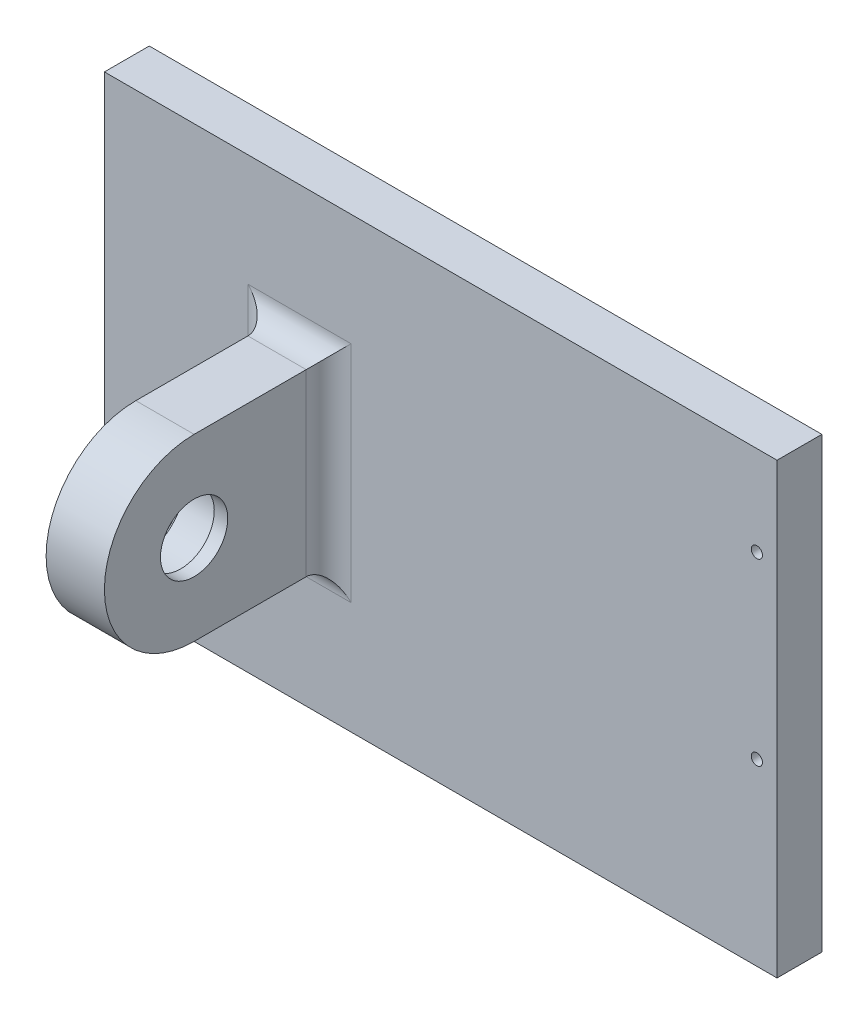
ISO-10303-21;
HEADER;
FILE_DESCRIPTION(('STEP AP214'),'2;1');
FILE_NAME('part.step','',(''),(''),'','','');
FILE_SCHEMA(('AUTOMOTIVE_DESIGN { 1 0 10303 214 1 1 1 1 }'));
ENDSEC;
DATA;
#1=APPLICATION_CONTEXT('core data for automotive mechanical design processes');
#2=APPLICATION_PROTOCOL_DEFINITION('international standard','automotive_design',2000,#1);
#3=PRODUCT_CONTEXT('',#1,'mechanical');
#4=PRODUCT('Part','Part','',(#3));
#5=PRODUCT_RELATED_PRODUCT_CATEGORY('part','',(#4));
#6=PRODUCT_DEFINITION_FORMATION('','',#4);
#7=PRODUCT_DEFINITION_CONTEXT('part definition',#1,'design');
#8=PRODUCT_DEFINITION('design','',#6,#7);
#9=PRODUCT_DEFINITION_SHAPE('','',#8);
#10=(LENGTH_UNIT() NAMED_UNIT(*) SI_UNIT(.MILLI.,.METRE.));
#11=(NAMED_UNIT(*) PLANE_ANGLE_UNIT() SI_UNIT($,.RADIAN.));
#12=(NAMED_UNIT(*) SI_UNIT($,.STERADIAN.) SOLID_ANGLE_UNIT());
#13=UNCERTAINTY_MEASURE_WITH_UNIT(LENGTH_MEASURE(1.E-05),#10,'distance_accuracy_value','');
#14=(GEOMETRIC_REPRESENTATION_CONTEXT(3) GLOBAL_UNCERTAINTY_ASSIGNED_CONTEXT((#13)) GLOBAL_UNIT_ASSIGNED_CONTEXT((#10,
#11,#12)) REPRESENTATION_CONTEXT('',''));
#15=CARTESIAN_POINT('',(0.,0.,0.));
#16=DIRECTION('',(0.,0.,1.));
#17=DIRECTION('',(1.,0.,0.));
#18=AXIS2_PLACEMENT_3D('',#15,#16,#17);
#19=CARTESIAN_POINT('',(0.,0.,10.));
#20=DIRECTION('',(0.,0.,1.));
#21=DIRECTION('',(1.,0.,0.));
#22=AXIS2_PLACEMENT_3D('',#19,#20,#21);
#23=PLANE('',#22);
#24=DIRECTION('',(0.,-1.,0.));
#25=VECTOR('',#24,1.);
#26=CARTESIAN_POINT('',(-20.,0.,10.));
#27=LINE('',#26,#25);
#28=CARTESIAN_POINT('',(-20.,25.,10.));
#29=VERTEX_POINT('',#28);
#30=CARTESIAN_POINT('',(-20.,-25.,10.));
#31=VERTEX_POINT('',#30);
#32=EDGE_CURVE('E189',#29,#31,#27,.T.);
#33=ORIENTED_EDGE('',*,*,#32,.T.);
#34=DIRECTION('',(-1.,0.,0.));
#35=VECTOR('',#34,1.);
#36=CARTESIAN_POINT('',(0.,-25.,10.));
#37=LINE('',#36,#35);
#38=CARTESIAN_POINT('',(-43.,-25.,10.));
#39=VERTEX_POINT('',#38);
#40=EDGE_CURVE('E195',#31,#39,#37,.T.);
#41=ORIENTED_EDGE('',*,*,#40,.T.);
#42=DIRECTION('',(0.,1.,0.));
#43=VECTOR('',#42,1.);
#44=CARTESIAN_POINT('',(-43.,0.,10.));
#45=LINE('',#44,#43);
#46=CARTESIAN_POINT('',(-43.,25.,10.));
#47=VERTEX_POINT('',#46);
#48=EDGE_CURVE('E193',#39,#47,#45,.T.);
#49=ORIENTED_EDGE('',*,*,#48,.T.);
#50=DIRECTION('',(1.,0.,0.));
#51=VECTOR('',#50,1.);
#52=CARTESIAN_POINT('',(0.,25.,10.));
#53=LINE('',#52,#51);
#54=EDGE_CURVE('E191',#47,#29,#53,.T.);
#55=ORIENTED_EDGE('',*,*,#54,.T.);
#56=EDGE_LOOP('',(#33,#41,#49,#55));
#57=FACE_BOUND('',#56,.T.);
#58=CARTESIAN_POINT('',(70.5,-10.00089870144,10.));
#59=DIRECTION('',(0.,0.,1.));
#60=DIRECTION('',(1.,0.,0.));
#61=AXIS2_PLACEMENT_3D('',#58,#59,#60);
#62=CIRCLE('',#61,1.24999999999999);
#63=CARTESIAN_POINT('',(71.75,-10.00089870144,10.));
#64=VERTEX_POINT('',#63);
#65=EDGE_CURVE('E214',#64,#64,#62,.T.);
#66=ORIENTED_EDGE('',*,*,#65,.F.);
#67=EDGE_LOOP('',(#66));
#68=FACE_BOUND('',#67,.T.);
#69=CARTESIAN_POINT('',(70.5,29.99910129856,10.));
#70=DIRECTION('',(0.,0.,1.));
#71=DIRECTION('',(1.,0.,0.));
#72=AXIS2_PLACEMENT_3D('',#69,#70,#71);
#73=CIRCLE('',#72,1.24999999999999);
#74=CARTESIAN_POINT('',(71.75,29.99910129856,10.));
#75=VERTEX_POINT('',#74);
#76=EDGE_CURVE('E321',#75,#75,#73,.T.);
#77=ORIENTED_EDGE('',*,*,#76,.F.);
#78=EDGE_LOOP('',(#77));
#79=FACE_BOUND('',#78,.T.);
#80=DIRECTION('',(0.,1.,0.));
#81=VECTOR('',#80,1.);
#82=CARTESIAN_POINT('',(75.,50.,10.));
#83=LINE('',#82,#81);
#84=CARTESIAN_POINT('',(75.,-50.,10.));
#85=VERTEX_POINT('',#84);
#86=CARTESIAN_POINT('',(75.,50.,10.));
#87=VERTEX_POINT('',#86);
#88=EDGE_CURVE('E160',#85,#87,#83,.T.);
#89=ORIENTED_EDGE('',*,*,#88,.T.);
#90=DIRECTION('',(-1.,0.,0.));
#91=VECTOR('',#90,1.);
#92=CARTESIAN_POINT('',(-75.,50.,10.));
#93=LINE('',#92,#91);
#94=CARTESIAN_POINT('',(-75.,50.,10.));
#95=VERTEX_POINT('',#94);
#96=EDGE_CURVE('E163',#87,#95,#93,.T.);
#97=ORIENTED_EDGE('',*,*,#96,.T.);
#98=DIRECTION('',(0.,-1.,0.));
#99=VECTOR('',#98,1.);
#100=CARTESIAN_POINT('',(-75.,50.,10.));
#101=LINE('',#100,#99);
#102=CARTESIAN_POINT('',(-75.,-50.,10.));
#103=VERTEX_POINT('',#102);
#104=EDGE_CURVE('E166',#95,#103,#101,.T.);
#105=ORIENTED_EDGE('',*,*,#104,.T.);
#106=DIRECTION('',(1.,0.,0.));
#107=VECTOR('',#106,1.);
#108=CARTESIAN_POINT('',(-75.,-50.,10.));
#109=LINE('',#108,#107);
#110=EDGE_CURVE('E168',#103,#85,#109,.T.);
#111=ORIENTED_EDGE('',*,*,#110,.T.);
#112=EDGE_LOOP('',(#89,#97,#105,#111));
#113=FACE_BOUND('',#112,.T.);
#114=ADVANCED_FACE('F43',(#57,#68,#79,#113),#23,.T.);
#115=CARTESIAN_POINT('',(75.,50.,10.));
#116=DIRECTION('',(-1.,0.,0.));
#117=DIRECTION('',(0.,-1.,0.));
#118=AXIS2_PLACEMENT_3D('',#115,#116,#117);
#119=PLANE('',#118);
#120=DIRECTION('',(0.,1.,0.));
#121=VECTOR('',#120,1.);
#122=CARTESIAN_POINT('',(75.,50.,0.));
#123=LINE('',#122,#121);
#124=CARTESIAN_POINT('',(75.,-50.,0.));
#125=VERTEX_POINT('',#124);
#126=CARTESIAN_POINT('',(75.,50.,0.));
#127=VERTEX_POINT('',#126);
#128=EDGE_CURVE('E159',#125,#127,#123,.T.);
#129=ORIENTED_EDGE('',*,*,#128,.T.);
#130=DIRECTION('',(0.,0.,-1.));
#131=VECTOR('',#130,1.);
#132=CARTESIAN_POINT('',(75.,50.,10.));
#133=LINE('',#132,#131);
#134=EDGE_CURVE('E186',#87,#127,#133,.T.);
#135=ORIENTED_EDGE('',*,*,#134,.F.);
#136=ORIENTED_EDGE('',*,*,#88,.F.);
#137=DIRECTION('',(0.,0.,-1.));
#138=VECTOR('',#137,1.);
#139=CARTESIAN_POINT('',(75.,-50.,10.));
#140=LINE('',#139,#138);
#141=EDGE_CURVE('E170',#85,#125,#140,.T.);
#142=ORIENTED_EDGE('',*,*,#141,.T.);
#143=EDGE_LOOP('',(#129,#135,#136,#142));
#144=FACE_BOUND('',#143,.T.);
#145=ADVANCED_FACE('F234',(#144),#119,.F.);
#146=CARTESIAN_POINT('',(-75.,50.,10.));
#147=DIRECTION('',(0.,-1.,0.));
#148=DIRECTION('',(0.,0.,-1.));
#149=AXIS2_PLACEMENT_3D('',#146,#147,#148);
#150=PLANE('',#149);
#151=DIRECTION('',(-1.,0.,0.));
#152=VECTOR('',#151,1.);
#153=CARTESIAN_POINT('',(-75.,50.,0.));
#154=LINE('',#153,#152);
#155=CARTESIAN_POINT('',(-75.,50.,0.));
#156=VERTEX_POINT('',#155);
#157=EDGE_CURVE('E173',#127,#156,#154,.T.);
#158=ORIENTED_EDGE('',*,*,#157,.T.);
#159=DIRECTION('',(0.,0.,-1.));
#160=VECTOR('',#159,1.);
#161=CARTESIAN_POINT('',(-75.,50.,10.));
#162=LINE('',#161,#160);
#163=EDGE_CURVE('E183',#95,#156,#162,.T.);
#164=ORIENTED_EDGE('',*,*,#163,.F.);
#165=ORIENTED_EDGE('',*,*,#96,.F.);
#166=ORIENTED_EDGE('',*,*,#134,.T.);
#167=EDGE_LOOP('',(#158,#164,#165,#166));
#168=FACE_BOUND('',#167,.T.);
#169=ADVANCED_FACE('F240',(#168),#150,.F.);
#170=CARTESIAN_POINT('',(-75.,50.,10.));
#171=DIRECTION('',(1.,0.,0.));
#172=DIRECTION('',(0.,1.,0.));
#173=AXIS2_PLACEMENT_3D('',#170,#171,#172);
#174=PLANE('',#173);
#175=DIRECTION('',(0.,-1.,0.));
#176=VECTOR('',#175,1.);
#177=CARTESIAN_POINT('',(-75.,50.,0.));
#178=LINE('',#177,#176);
#179=CARTESIAN_POINT('',(-75.,-50.,0.));
#180=VERTEX_POINT('',#179);
#181=EDGE_CURVE('E175',#156,#180,#178,.T.);
#182=ORIENTED_EDGE('',*,*,#181,.T.);
#183=DIRECTION('',(0.,0.,-1.));
#184=VECTOR('',#183,1.);
#185=CARTESIAN_POINT('',(-75.,-50.,10.));
#186=LINE('',#185,#184);
#187=EDGE_CURVE('E180',#103,#180,#186,.T.);
#188=ORIENTED_EDGE('',*,*,#187,.F.);
#189=ORIENTED_EDGE('',*,*,#104,.F.);
#190=ORIENTED_EDGE('',*,*,#163,.T.);
#191=EDGE_LOOP('',(#182,#188,#189,#190));
#192=FACE_BOUND('',#191,.T.);
#193=ADVANCED_FACE('F255',(#192),#174,.F.);
#194=CARTESIAN_POINT('',(-75.,-50.,10.));
#195=DIRECTION('',(0.,1.,0.));
#196=DIRECTION('',(0.,0.,1.));
#197=AXIS2_PLACEMENT_3D('',#194,#195,#196);
#198=PLANE('',#197);
#199=DIRECTION('',(1.,0.,0.));
#200=VECTOR('',#199,1.);
#201=CARTESIAN_POINT('',(-75.,-50.,0.));
#202=LINE('',#201,#200);
#203=EDGE_CURVE('E164',#180,#125,#202,.T.);
#204=ORIENTED_EDGE('',*,*,#203,.T.);
#205=ORIENTED_EDGE('',*,*,#141,.F.);
#206=ORIENTED_EDGE('',*,*,#110,.F.);
#207=ORIENTED_EDGE('',*,*,#187,.T.);
#208=EDGE_LOOP('',(#204,#205,#206,#207));
#209=FACE_BOUND('',#208,.T.);
#210=ADVANCED_FACE('F251',(#209),#198,.F.);
#211=CARTESIAN_POINT('',(0.,0.,0.));
#212=DIRECTION('',(0.,0.,1.));
#213=DIRECTION('',(1.,0.,0.));
#214=AXIS2_PLACEMENT_3D('',#211,#212,#213);
#215=PLANE('',#214);
#216=CARTESIAN_POINT('',(70.5,-10.00089870144,0.));
#217=DIRECTION('',(0.,0.,1.));
#218=DIRECTION('',(1.,0.,0.));
#219=AXIS2_PLACEMENT_3D('',#216,#217,#218);
#220=CIRCLE('',#219,1.24999999999999);
#221=CARTESIAN_POINT('',(71.75,-10.00089870144,0.));
#222=VERTEX_POINT('',#221);
#223=EDGE_CURVE('E323',#222,#222,#220,.T.);
#224=ORIENTED_EDGE('',*,*,#223,.T.);
#225=EDGE_LOOP('',(#224));
#226=FACE_BOUND('',#225,.T.);
#227=CARTESIAN_POINT('',(70.5,29.99910129856,0.));
#228=DIRECTION('',(0.,0.,1.));
#229=DIRECTION('',(1.,0.,0.));
#230=AXIS2_PLACEMENT_3D('',#227,#228,#229);
#231=CIRCLE('',#230,1.24999999999999);
#232=CARTESIAN_POINT('',(71.75,29.99910129856,0.));
#233=VERTEX_POINT('',#232);
#234=EDGE_CURVE('E152',#233,#233,#231,.T.);
#235=ORIENTED_EDGE('',*,*,#234,.T.);
#236=EDGE_LOOP('',(#235));
#237=FACE_BOUND('',#236,.T.);
#238=ORIENTED_EDGE('',*,*,#128,.F.);
#239=ORIENTED_EDGE('',*,*,#203,.F.);
#240=ORIENTED_EDGE('',*,*,#181,.F.);
#241=ORIENTED_EDGE('',*,*,#157,.F.);
#242=EDGE_LOOP('',(#238,#239,#240,#241));
#243=FACE_BOUND('',#242,.T.);
#244=ADVANCED_FACE('F248',(#226,#237,#243),#215,.F.);
#245=CARTESIAN_POINT('',(-25.,20.,40.));
#246=DIRECTION('',(0.,-1.,0.));
#247=DIRECTION('',(1.,0.,0.));
#248=AXIS2_PLACEMENT_3D('',#245,#246,#247);
#249=PLANE('',#248);
#250=DIRECTION('',(0.,0.,-1.));
#251=VECTOR('',#250,1.);
#252=CARTESIAN_POINT('',(-25.,20.,40.));
#253=LINE('',#252,#251);
#254=CARTESIAN_POINT('',(-25.,20.,40.));
#255=VERTEX_POINT('',#254);
#256=CARTESIAN_POINT('',(-25.,20.,15.));
#257=VERTEX_POINT('',#256);
#258=EDGE_CURVE('E133',#255,#257,#253,.T.);
#259=ORIENTED_EDGE('',*,*,#258,.T.);
#260=DIRECTION('',(1.,0.,0.));
#261=VECTOR('',#260,1.);
#262=CARTESIAN_POINT('',(-25.,20.,15.));
#263=LINE('',#262,#261);
#264=CARTESIAN_POINT('',(-38.,20.,15.));
#265=VERTEX_POINT('',#264);
#266=EDGE_CURVE('E66',#257,#265,#263,.F.);
#267=ORIENTED_EDGE('',*,*,#266,.T.);
#268=DIRECTION('',(0.,0.,-1.));
#269=VECTOR('',#268,1.);
#270=CARTESIAN_POINT('',(-38.,20.,40.));
#271=LINE('',#270,#269);
#272=CARTESIAN_POINT('',(-38.,20.,40.));
#273=VERTEX_POINT('',#272);
#274=EDGE_CURVE('E142',#273,#265,#271,.T.);
#275=ORIENTED_EDGE('',*,*,#274,.F.);
#276=DIRECTION('',(-1.,0.,0.));
#277=VECTOR('',#276,1.);
#278=CARTESIAN_POINT('',(-25.,20.,40.));
#279=LINE('',#278,#277);
#280=EDGE_CURVE('E134',#255,#273,#279,.T.);
#281=ORIENTED_EDGE('',*,*,#280,.F.);
#282=EDGE_LOOP('',(#259,#267,#275,#281));
#283=FACE_BOUND('',#282,.T.);
#284=ADVANCED_FACE('F246',(#283),#249,.F.);
#285=CARTESIAN_POINT('',(-38.,20.,40.));
#286=DIRECTION('',(1.,0.,0.));
#287=DIRECTION('',(0.,1.,0.));
#288=AXIS2_PLACEMENT_3D('',#285,#286,#287);
#289=PLANE('',#288);
#290=CARTESIAN_POINT('',(-38.,0.,40.));
#291=DIRECTION('',(1.,0.,0.));
#292=DIRECTION('',(0.,1.,0.));
#293=AXIS2_PLACEMENT_3D('',#290,#291,#292);
#294=CIRCLE('',#293,11.);
#295=CARTESIAN_POINT('',(-38.,11.,40.));
#296=VERTEX_POINT('',#295);
#297=EDGE_CURVE('E11',#296,#296,#294,.T.);
#298=ORIENTED_EDGE('',*,*,#297,.T.);
#299=EDGE_LOOP('',(#298));
#300=FACE_BOUND('',#299,.T.);
#301=ORIENTED_EDGE('',*,*,#274,.T.);
#302=DIRECTION('',(0.,1.,0.));
#303=VECTOR('',#302,1.);
#304=CARTESIAN_POINT('',(-38.,20.,15.));
#305=LINE('',#304,#303);
#306=CARTESIAN_POINT('',(-38.,-20.,15.));
#307=VERTEX_POINT('',#306);
#308=EDGE_CURVE('E141',#265,#307,#305,.F.);
#309=ORIENTED_EDGE('',*,*,#308,.T.);
#310=DIRECTION('',(0.,0.,-1.));
#311=VECTOR('',#310,1.);
#312=CARTESIAN_POINT('',(-38.,-20.,40.));
#313=LINE('',#312,#311);
#314=CARTESIAN_POINT('',(-38.,-20.,40.));
#315=VERTEX_POINT('',#314);
#316=EDGE_CURVE('E126',#315,#307,#313,.T.);
#317=ORIENTED_EDGE('',*,*,#316,.F.);
#318=CARTESIAN_POINT('',(-38.,0.,40.));
#319=DIRECTION('',(-1.,0.,0.));
#320=DIRECTION('',(0.,-1.,0.));
#321=AXIS2_PLACEMENT_3D('',#318,#319,#320);
#322=CIRCLE('',#321,20.);
#323=EDGE_CURVE('E139',#315,#273,#322,.T.);
#324=ORIENTED_EDGE('',*,*,#323,.T.);
#325=EDGE_LOOP('',(#301,#309,#317,#324));
#326=FACE_BOUND('',#325,.T.);
#327=ADVANCED_FACE('F138',(#300,#326),#289,.F.);
#328=CARTESIAN_POINT('',(-38.,-20.,40.));
#329=DIRECTION('',(0.,1.,0.));
#330=DIRECTION('',(0.,0.,1.));
#331=AXIS2_PLACEMENT_3D('',#328,#329,#330);
#332=PLANE('',#331);
#333=ORIENTED_EDGE('',*,*,#316,.T.);
#334=DIRECTION('',(-1.,0.,0.));
#335=VECTOR('',#334,1.);
#336=CARTESIAN_POINT('',(-38.,-20.,15.));
#337=LINE('',#336,#335);
#338=CARTESIAN_POINT('',(-25.,-20.,15.));
#339=VERTEX_POINT('',#338);
#340=EDGE_CURVE('E198',#307,#339,#337,.F.);
#341=ORIENTED_EDGE('',*,*,#340,.T.);
#342=DIRECTION('',(0.,0.,-1.));
#343=VECTOR('',#342,1.);
#344=CARTESIAN_POINT('',(-25.,-20.,40.));
#345=LINE('',#344,#343);
#346=CARTESIAN_POINT('',(-25.,-20.,40.));
#347=VERTEX_POINT('',#346);
#348=EDGE_CURVE('E128',#347,#339,#345,.T.);
#349=ORIENTED_EDGE('',*,*,#348,.F.);
#350=DIRECTION('',(1.,0.,0.));
#351=VECTOR('',#350,1.);
#352=CARTESIAN_POINT('',(-38.,-20.,40.));
#353=LINE('',#352,#351);
#354=EDGE_CURVE('E122',#315,#347,#353,.T.);
#355=ORIENTED_EDGE('',*,*,#354,.F.);
#356=EDGE_LOOP('',(#333,#341,#349,#355));
#357=FACE_BOUND('',#356,.T.);
#358=ADVANCED_FACE('F124',(#357),#332,.F.);
#359=CARTESIAN_POINT('',(-25.,-20.,40.));
#360=DIRECTION('',(-1.,0.,0.));
#361=DIRECTION('',(0.,0.,1.));
#362=AXIS2_PLACEMENT_3D('',#359,#360,#361);
#363=PLANE('',#362);
#364=CARTESIAN_POINT('',(-25.,0.,40.));
#365=DIRECTION('',(-1.,0.,0.));
#366=DIRECTION('',(0.,0.,1.));
#367=AXIS2_PLACEMENT_3D('',#364,#365,#366);
#368=CIRCLE('',#367,7.5);
#369=CARTESIAN_POINT('',(-25.,0.,47.5));
#370=VERTEX_POINT('',#369);
#371=EDGE_CURVE('E206',#370,#370,#368,.T.);
#372=ORIENTED_EDGE('',*,*,#371,.T.);
#373=EDGE_LOOP('',(#372));
#374=FACE_BOUND('',#373,.T.);
#375=ORIENTED_EDGE('',*,*,#348,.T.);
#376=DIRECTION('',(0.,-1.,0.));
#377=VECTOR('',#376,1.);
#378=CARTESIAN_POINT('',(-25.,-20.,15.));
#379=LINE('',#378,#377);
#380=EDGE_CURVE('E59',#339,#257,#379,.F.);
#381=ORIENTED_EDGE('',*,*,#380,.T.);
#382=ORIENTED_EDGE('',*,*,#258,.F.);
#383=CARTESIAN_POINT('',(-25.,0.,40.));
#384=DIRECTION('',(-1.,0.,0.));
#385=DIRECTION('',(0.,-1.,0.));
#386=AXIS2_PLACEMENT_3D('',#383,#384,#385);
#387=CIRCLE('',#386,20.);
#388=EDGE_CURVE('E147',#347,#255,#387,.T.);
#389=ORIENTED_EDGE('',*,*,#388,.F.);
#390=EDGE_LOOP('',(#375,#381,#382,#389));
#391=FACE_BOUND('',#390,.T.);
#392=ADVANCED_FACE('F290',(#374,#391),#363,.F.);
#393=CARTESIAN_POINT('',(-25.,0.,40.));
#394=DIRECTION('',(-1.,0.,0.));
#395=DIRECTION('',(0.,-1.,0.));
#396=AXIS2_PLACEMENT_3D('',#393,#394,#395);
#397=CYLINDRICAL_SURFACE('',#396,20.);
#398=ORIENTED_EDGE('',*,*,#388,.T.);
#399=ORIENTED_EDGE('',*,*,#280,.T.);
#400=ORIENTED_EDGE('',*,*,#323,.F.);
#401=ORIENTED_EDGE('',*,*,#354,.T.);
#402=EDGE_LOOP('',(#398,#399,#400,#401));
#403=FACE_BOUND('',#402,.T.);
#404=ADVANCED_FACE('F145',(#403),#397,.T.);
#405=CARTESIAN_POINT('',(-28.,0.,40.));
#406=DIRECTION('',(-1.,0.,0.));
#407=DIRECTION('',(0.,-1.,0.));
#408=AXIS2_PLACEMENT_3D('',#405,#406,#407);
#409=CYLINDRICAL_SURFACE('',#408,10.);
#410=CARTESIAN_POINT('',(-37.,0.,40.));
#411=DIRECTION('',(1.,0.,0.));
#412=DIRECTION('',(0.,1.,0.));
#413=AXIS2_PLACEMENT_3D('',#410,#411,#412);
#414=CIRCLE('',#413,10.);
#415=CARTESIAN_POINT('',(-37.,9.99999999999999,40.));
#416=VERTEX_POINT('',#415);
#417=EDGE_CURVE('E52',#416,#416,#414,.F.);
#418=ORIENTED_EDGE('',*,*,#417,.T.);
#419=EDGE_LOOP('',(#418));
#420=FACE_BOUND('',#419,.T.);
#421=CARTESIAN_POINT('',(-28.,0.,40.));
#422=DIRECTION('',(-1.,0.,0.));
#423=DIRECTION('',(0.,-1.,0.));
#424=AXIS2_PLACEMENT_3D('',#421,#422,#423);
#425=CIRCLE('',#424,10.);
#426=CARTESIAN_POINT('',(-28.,-10.,40.));
#427=VERTEX_POINT('',#426);
#428=EDGE_CURVE('E148',#427,#427,#425,.T.);
#429=ORIENTED_EDGE('',*,*,#428,.F.);
#430=EDGE_LOOP('',(#429));
#431=FACE_BOUND('',#430,.T.);
#432=ADVANCED_FACE('F220',(#420,#431),#409,.F.);
#433=CARTESIAN_POINT('',(-28.,0.,40.));
#434=DIRECTION('',(-1.,0.,0.));
#435=DIRECTION('',(0.,-1.,0.));
#436=AXIS2_PLACEMENT_3D('',#433,#434,#435);
#437=PLANE('',#436);
#438=CARTESIAN_POINT('',(-28.,0.,40.));
#439=DIRECTION('',(-1.,0.,0.));
#440=DIRECTION('',(0.,-1.,0.));
#441=AXIS2_PLACEMENT_3D('',#438,#439,#440);
#442=CIRCLE('',#441,7.5);
#443=CARTESIAN_POINT('',(-28.,-7.50000000000001,40.));
#444=VERTEX_POINT('',#443);
#445=EDGE_CURVE('E216',#444,#444,#442,.T.);
#446=ORIENTED_EDGE('',*,*,#445,.F.);
#447=EDGE_LOOP('',(#446));
#448=FACE_BOUND('',#447,.T.);
#449=ORIENTED_EDGE('',*,*,#428,.T.);
#450=EDGE_LOOP('',(#449));
#451=FACE_BOUND('',#450,.T.);
#452=ADVANCED_FACE('F308',(#448,#451),#437,.T.);
#453=CARTESIAN_POINT('',(70.5,29.99910129856,10.));
#454=DIRECTION('',(0.,0.,1.));
#455=DIRECTION('',(1.,0.,0.));
#456=AXIS2_PLACEMENT_3D('',#453,#454,#455);
#457=CYLINDRICAL_SURFACE('',#456,1.24999999999999);
#458=ORIENTED_EDGE('',*,*,#234,.F.);
#459=EDGE_LOOP('',(#458));
#460=FACE_BOUND('',#459,.T.);
#461=ORIENTED_EDGE('',*,*,#76,.T.);
#462=EDGE_LOOP('',(#461));
#463=FACE_BOUND('',#462,.T.);
#464=ADVANCED_FACE('F280',(#460,#463),#457,.F.);
#465=CARTESIAN_POINT('',(70.5,-10.00089870144,10.));
#466=DIRECTION('',(0.,0.,1.));
#467=DIRECTION('',(1.,0.,0.));
#468=AXIS2_PLACEMENT_3D('',#465,#466,#467);
#469=CYLINDRICAL_SURFACE('',#468,1.24999999999999);
#470=ORIENTED_EDGE('',*,*,#223,.F.);
#471=EDGE_LOOP('',(#470));
#472=FACE_BOUND('',#471,.T.);
#473=ORIENTED_EDGE('',*,*,#65,.T.);
#474=EDGE_LOOP('',(#473));
#475=FACE_BOUND('',#474,.T.);
#476=ADVANCED_FACE('F275',(#472,#475),#469,.F.);
#477=CARTESIAN_POINT('',(0.,25.,15.));
#478=DIRECTION('',(1.,0.,0.));
#479=DIRECTION('',(0.,1.,0.));
#480=AXIS2_PLACEMENT_3D('',#477,#478,#479);
#481=CYLINDRICAL_SURFACE('',#480,5.);
#482=CARTESIAN_POINT('',(-43.,25.,15.));
#483=DIRECTION('',(0.707106781186548,0.707106781186548,0.));
#484=DIRECTION('',(0.707106781186547,-0.707106781186547,0.));
#485=AXIS2_PLACEMENT_3D('',#482,#483,#484);
#486=ELLIPSE('',#485,7.07106781186548,5.);
#487=EDGE_CURVE('E208',#265,#47,#486,.T.);
#488=ORIENTED_EDGE('',*,*,#487,.F.);
#489=ORIENTED_EDGE('',*,*,#266,.F.);
#490=CARTESIAN_POINT('',(-20.,25.,15.));
#491=DIRECTION('',(0.707106781186547,-0.707106781186548,0.));
#492=DIRECTION('',(-0.707106781186548,-0.707106781186547,0.));
#493=AXIS2_PLACEMENT_3D('',#490,#491,#492);
#494=ELLIPSE('',#493,7.07106781186547,5.);
#495=EDGE_CURVE('E211',#29,#257,#494,.F.);
#496=ORIENTED_EDGE('',*,*,#495,.F.);
#497=ORIENTED_EDGE('',*,*,#54,.F.);
#498=EDGE_LOOP('',(#488,#489,#496,#497));
#499=FACE_BOUND('',#498,.T.);
#500=ADVANCED_FACE('F272',(#499),#481,.F.);
#501=CARTESIAN_POINT('',(-20.,0.,15.));
#502=DIRECTION('',(0.,-1.,0.));
#503=DIRECTION('',(0.,0.,-1.));
#504=AXIS2_PLACEMENT_3D('',#501,#502,#503);
#505=CYLINDRICAL_SURFACE('',#504,5.);
#506=ORIENTED_EDGE('',*,*,#495,.T.);
#507=ORIENTED_EDGE('',*,*,#380,.F.);
#508=CARTESIAN_POINT('',(-20.,-25.,15.));
#509=DIRECTION('',(-0.707106781186547,-0.707106781186547,0.));
#510=DIRECTION('',(0.707106781186547,-0.707106781186547,0.));
#511=AXIS2_PLACEMENT_3D('',#508,#509,#510);
#512=ELLIPSE('',#511,7.07106781186547,5.);
#513=EDGE_CURVE('E205',#31,#339,#512,.F.);
#514=ORIENTED_EDGE('',*,*,#513,.F.);
#515=ORIENTED_EDGE('',*,*,#32,.F.);
#516=EDGE_LOOP('',(#506,#507,#514,#515));
#517=FACE_BOUND('',#516,.T.);
#518=ADVANCED_FACE('F269',(#517),#505,.F.);
#519=CARTESIAN_POINT('',(-43.,0.,15.));
#520=DIRECTION('',(0.,1.,0.));
#521=DIRECTION('',(-1.,0.,0.));
#522=AXIS2_PLACEMENT_3D('',#519,#520,#521);
#523=CYLINDRICAL_SURFACE('',#522,5.);
#524=ORIENTED_EDGE('',*,*,#487,.T.);
#525=ORIENTED_EDGE('',*,*,#48,.F.);
#526=CARTESIAN_POINT('',(-43.,-25.,15.));
#527=DIRECTION('',(-0.707106781186548,0.707106781186547,0.));
#528=DIRECTION('',(0.707106781186547,0.707106781186548,0.));
#529=AXIS2_PLACEMENT_3D('',#526,#527,#528);
#530=ELLIPSE('',#529,7.07106781186547,5.);
#531=EDGE_CURVE('E203',#307,#39,#530,.T.);
#532=ORIENTED_EDGE('',*,*,#531,.F.);
#533=ORIENTED_EDGE('',*,*,#308,.F.);
#534=EDGE_LOOP('',(#524,#525,#532,#533));
#535=FACE_BOUND('',#534,.T.);
#536=ADVANCED_FACE('F265',(#535),#523,.F.);
#537=CARTESIAN_POINT('',(0.,-25.,15.));
#538=DIRECTION('',(-1.,0.,0.));
#539=DIRECTION('',(0.,0.,1.));
#540=AXIS2_PLACEMENT_3D('',#537,#538,#539);
#541=CYLINDRICAL_SURFACE('',#540,5.);
#542=ORIENTED_EDGE('',*,*,#513,.T.);
#543=ORIENTED_EDGE('',*,*,#340,.F.);
#544=ORIENTED_EDGE('',*,*,#531,.T.);
#545=ORIENTED_EDGE('',*,*,#40,.F.);
#546=EDGE_LOOP('',(#542,#543,#544,#545));
#547=FACE_BOUND('',#546,.T.);
#548=ADVANCED_FACE('F229',(#547),#541,.F.);
#549=CARTESIAN_POINT('',(75.,0.,40.));
#550=DIRECTION('',(-1.,0.,0.));
#551=DIRECTION('',(0.,-1.,0.));
#552=AXIS2_PLACEMENT_3D('',#549,#550,#551);
#553=CYLINDRICAL_SURFACE('',#552,7.5);
#554=ORIENTED_EDGE('',*,*,#445,.T.);
#555=EDGE_LOOP('',(#554));
#556=FACE_BOUND('',#555,.T.);
#557=ORIENTED_EDGE('',*,*,#371,.F.);
#558=EDGE_LOOP('',(#557));
#559=FACE_BOUND('',#558,.T.);
#560=ADVANCED_FACE('F224',(#556,#559),#553,.F.);
#561=CARTESIAN_POINT('',(-37.,0.,40.));
#562=DIRECTION('',(-1.,0.,0.));
#563=DIRECTION('',(0.,-1.,0.));
#564=AXIS2_PLACEMENT_3D('',#561,#562,#563);
#565=CONICAL_SURFACE('',#564,10.,0.785398163397449);
#566=ORIENTED_EDGE('',*,*,#297,.F.);
#567=EDGE_LOOP('',(#566));
#568=FACE_BOUND('',#567,.T.);
#569=ORIENTED_EDGE('',*,*,#417,.F.);
#570=EDGE_LOOP('',(#569));
#571=FACE_BOUND('',#570,.T.);
#572=ADVANCED_FACE('F46',(#568,#571),#565,.F.);
#573=CLOSED_SHELL('',(#114,#145,#169,#193,#210,#244,#284,#327,#358,#392,#404,#432,#452,#464,
#476,#500,#518,#536,#548,#560,#572));
#574=MANIFOLD_SOLID_BREP('B2',#573);
#575=ADVANCED_BREP_SHAPE_REPRESENTATION('',(#18,#574),#14);
#576=SHAPE_DEFINITION_REPRESENTATION(#9,#575);
ENDSEC;
END-ISO-10303-21;
